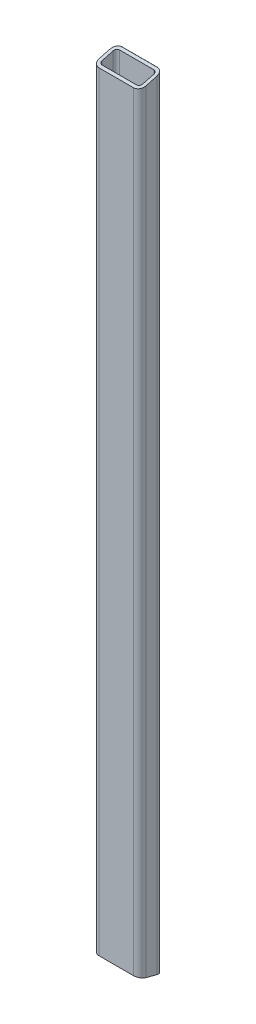
ISO-10303-21;
HEADER;
FILE_DESCRIPTION(('STEP AP214'),'2;1');
FILE_NAME('part.step','',(''),(''),'','','');
FILE_SCHEMA(('AUTOMOTIVE_DESIGN { 1 0 10303 214 1 1 1 1 }'));
ENDSEC;
DATA;
#1=APPLICATION_CONTEXT('core data for automotive mechanical design processes');
#2=APPLICATION_PROTOCOL_DEFINITION('international standard','automotive_design',2000,#1);
#3=PRODUCT_CONTEXT('',#1,'mechanical');
#4=PRODUCT('Part','Part','',(#3));
#5=PRODUCT_RELATED_PRODUCT_CATEGORY('part','',(#4));
#6=PRODUCT_DEFINITION_FORMATION('','',#4);
#7=PRODUCT_DEFINITION_CONTEXT('part definition',#1,'design');
#8=PRODUCT_DEFINITION('design','',#6,#7);
#9=PRODUCT_DEFINITION_SHAPE('','',#8);
#10=(LENGTH_UNIT() NAMED_UNIT(*) SI_UNIT(.MILLI.,.METRE.));
#11=(NAMED_UNIT(*) PLANE_ANGLE_UNIT() SI_UNIT($,.RADIAN.));
#12=(NAMED_UNIT(*) SI_UNIT($,.STERADIAN.) SOLID_ANGLE_UNIT());
#13=UNCERTAINTY_MEASURE_WITH_UNIT(LENGTH_MEASURE(1.E-05),#10,'distance_accuracy_value','');
#14=(GEOMETRIC_REPRESENTATION_CONTEXT(3) GLOBAL_UNCERTAINTY_ASSIGNED_CONTEXT((#13)) GLOBAL_UNIT_ASSIGNED_CONTEXT((#10,
#11,#12)) REPRESENTATION_CONTEXT('',''));
#15=CARTESIAN_POINT('',(0.,0.,0.));
#16=DIRECTION('',(0.,0.,1.));
#17=DIRECTION('',(1.,0.,0.));
#18=AXIS2_PLACEMENT_3D('',#15,#16,#17);
#19=CARTESIAN_POINT('',(-11.,-250.,3.5));
#20=DIRECTION('',(0.,1.,0.));
#21=DIRECTION('',(0.,0.,1.));
#22=AXIS2_PLACEMENT_3D('',#19,#20,#21);
#23=CYLINDRICAL_SURFACE('',#22,4.);
#24=DIRECTION('',(0.,1.,0.));
#25=VECTOR('',#24,1.);
#26=CARTESIAN_POINT('',(-15.,-250.,3.5));
#27=LINE('',#26,#25);
#28=CARTESIAN_POINT('',(-15.,-247.071796769725,3.5));
#29=VERTEX_POINT('',#28);
#30=CARTESIAN_POINT('',(-15.,247.071796769724,3.5));
#31=VERTEX_POINT('',#30);
#32=EDGE_CURVE('E388',#29,#31,#27,.T.);
#33=ORIENTED_EDGE('',*,*,#32,.F.);
#34=CARTESIAN_POINT('',(-11.,-247.071796769725,3.5));
#35=DIRECTION('',(0.,-0.965925826289068,0.258819045102522));
#36=DIRECTION('',(0.,0.258819045102522,0.965925826289068));
#37=AXIS2_PLACEMENT_3D('',#34,#35,#36);
#38=ELLIPSE('',#37,4.14110472164033,4.);
#39=CARTESIAN_POINT('',(-11.,-246.,7.5));
#40=VERTEX_POINT('',#39);
#41=EDGE_CURVE('E151',#29,#40,#38,.F.);
#42=ORIENTED_EDGE('',*,*,#41,.T.);
#43=DIRECTION('',(0.,1.,0.));
#44=VECTOR('',#43,1.);
#45=CARTESIAN_POINT('',(-11.,-250.,7.5));
#46=LINE('',#45,#44);
#47=CARTESIAN_POINT('',(-11.,246.,7.5));
#48=VERTEX_POINT('',#47);
#49=EDGE_CURVE('E387',#40,#48,#46,.T.);
#50=ORIENTED_EDGE('',*,*,#49,.T.);
#51=CARTESIAN_POINT('',(-11.,247.071796769724,3.5));
#52=DIRECTION('',(0.,-0.965925826289068,-0.258819045102522));
#53=DIRECTION('',(0.,0.258819045102522,-0.965925826289068));
#54=AXIS2_PLACEMENT_3D('',#51,#52,#53);
#55=ELLIPSE('',#54,4.14110472164033,4.);
#56=EDGE_CURVE('E160',#48,#31,#55,.T.);
#57=ORIENTED_EDGE('',*,*,#56,.T.);
#58=EDGE_LOOP('',(#33,#42,#50,#57));
#59=FACE_BOUND('',#58,.T.);
#60=ADVANCED_FACE('F140',(#59),#23,.T.);
#61=CARTESIAN_POINT('',(-15.,-250.,-3.5));
#62=DIRECTION('',(-1.,0.,0.));
#63=DIRECTION('',(0.,0.,1.));
#64=AXIS2_PLACEMENT_3D('',#61,#62,#63);
#65=PLANE('',#64);
#66=DIRECTION('',(0.,1.,0.));
#67=VECTOR('',#66,1.);
#68=CARTESIAN_POINT('',(-15.,-250.,-3.5));
#69=LINE('',#68,#67);
#70=CARTESIAN_POINT('',(-15.,-248.947441116742,-3.5));
#71=VERTEX_POINT('',#70);
#72=CARTESIAN_POINT('',(-15.,248.947441116742,-3.5));
#73=VERTEX_POINT('',#72);
#74=EDGE_CURVE('E282',#71,#73,#69,.T.);
#75=ORIENTED_EDGE('',*,*,#74,.F.);
#76=DIRECTION('',(0.,0.258819045102522,0.965925826289068));
#77=VECTOR('',#76,1.);
#78=CARTESIAN_POINT('',(-15.,-249.017949192431,-3.76313972081441));
#79=LINE('',#78,#77);
#80=EDGE_CURVE('E313',#71,#29,#79,.T.);
#81=ORIENTED_EDGE('',*,*,#80,.T.);
#82=ORIENTED_EDGE('',*,*,#32,.T.);
#83=DIRECTION('',(0.,-0.258819045102522,0.965925826289068));
#84=VECTOR('',#83,1.);
#85=CARTESIAN_POINT('',(-15.,215.52430013854,121.236860279186));
#86=LINE('',#85,#84);
#87=EDGE_CURVE('E311',#31,#73,#86,.F.);
#88=ORIENTED_EDGE('',*,*,#87,.T.);
#89=EDGE_LOOP('',(#75,#81,#82,#88));
#90=FACE_BOUND('',#89,.T.);
#91=ADVANCED_FACE('F440',(#90),#65,.T.);
#92=CARTESIAN_POINT('',(-11.,-250.,-3.5));
#93=DIRECTION('',(0.,1.,0.));
#94=DIRECTION('',(0.,0.,1.));
#95=AXIS2_PLACEMENT_3D('',#92,#93,#94);
#96=CYLINDRICAL_SURFACE('',#95,4.);
#97=CARTESIAN_POINT('',(-11.,-250.,-3.5));
#98=DIRECTION('',(0.,1.,0.));
#99=DIRECTION('',(0.,0.,1.));
#100=AXIS2_PLACEMENT_3D('',#97,#98,#99);
#101=CIRCLE('',#100,4.);
#102=CARTESIAN_POINT('',(-11.,-250.,-7.5));
#103=VERTEX_POINT('',#102);
#104=CARTESIAN_POINT('',(-11.7544662892758,-250.,-7.42820323027544));
#105=VERTEX_POINT('',#104);
#106=EDGE_CURVE('E385',#103,#105,#101,.T.);
#107=ORIENTED_EDGE('',*,*,#106,.T.);
#108=CARTESIAN_POINT('',(-11.,-248.947441116742,-3.5));
#109=DIRECTION('',(0.,-0.965925826289068,0.258819045102522));
#110=DIRECTION('',(0.,0.258819045102522,0.965925826289068));
#111=AXIS2_PLACEMENT_3D('',#108,#109,#110);
#112=ELLIPSE('',#111,4.14110472164033,4.);
#113=EDGE_CURVE('E286',#105,#71,#112,.F.);
#114=ORIENTED_EDGE('',*,*,#113,.T.);
#115=ORIENTED_EDGE('',*,*,#74,.T.);
#116=CARTESIAN_POINT('',(-11.,248.947441116742,-3.5));
#117=DIRECTION('',(0.,-0.965925826289068,-0.258819045102522));
#118=DIRECTION('',(0.,0.258819045102522,-0.965925826289068));
#119=AXIS2_PLACEMENT_3D('',#116,#117,#118);
#120=ELLIPSE('',#119,4.14110472164033,4.);
#121=CARTESIAN_POINT('',(-11.7544662892758,250.,-7.42820323027544));
#122=VERTEX_POINT('',#121);
#123=EDGE_CURVE('E276',#73,#122,#120,.T.);
#124=ORIENTED_EDGE('',*,*,#123,.T.);
#125=CARTESIAN_POINT('',(-11.,250.,-3.5));
#126=DIRECTION('',(0.,1.,0.));
#127=DIRECTION('',(0.,0.,1.));
#128=AXIS2_PLACEMENT_3D('',#125,#126,#127);
#129=CIRCLE('',#128,4.);
#130=CARTESIAN_POINT('',(-11.,250.,-7.5));
#131=VERTEX_POINT('',#130);
#132=EDGE_CURVE('E280',#131,#122,#129,.T.);
#133=ORIENTED_EDGE('',*,*,#132,.F.);
#134=DIRECTION('',(0.,1.,0.));
#135=VECTOR('',#134,1.);
#136=CARTESIAN_POINT('',(-11.,-250.,-7.5));
#137=LINE('',#136,#135);
#138=EDGE_CURVE('E392',#103,#131,#137,.T.);
#139=ORIENTED_EDGE('',*,*,#138,.F.);
#140=EDGE_LOOP('',(#107,#114,#115,#124,#133,#139));
#141=FACE_BOUND('',#140,.T.);
#142=ADVANCED_FACE('F279',(#141),#96,.T.);
#143=CARTESIAN_POINT('',(-11.,-250.,-7.5));
#144=DIRECTION('',(0.,0.,-1.));
#145=DIRECTION('',(-1.,0.,0.));
#146=AXIS2_PLACEMENT_3D('',#143,#144,#145);
#147=PLANE('',#146);
#148=ORIENTED_EDGE('',*,*,#138,.T.);
#149=DIRECTION('',(-1.,0.,0.));
#150=VECTOR('',#149,1.);
#151=CARTESIAN_POINT('',(-11.,250.,-7.5));
#152=LINE('',#151,#150);
#153=CARTESIAN_POINT('',(11.,250.,-7.5));
#154=VERTEX_POINT('',#153);
#155=EDGE_CURVE('E291',#154,#131,#152,.T.);
#156=ORIENTED_EDGE('',*,*,#155,.F.);
#157=DIRECTION('',(0.,1.,0.));
#158=VECTOR('',#157,1.);
#159=CARTESIAN_POINT('',(11.,-250.,-7.5));
#160=LINE('',#159,#158);
#161=CARTESIAN_POINT('',(11.,-250.,-7.5));
#162=VERTEX_POINT('',#161);
#163=EDGE_CURVE('E394',#162,#154,#160,.T.);
#164=ORIENTED_EDGE('',*,*,#163,.F.);
#165=DIRECTION('',(-1.,0.,0.));
#166=VECTOR('',#165,1.);
#167=CARTESIAN_POINT('',(-11.,-250.,-7.5));
#168=LINE('',#167,#166);
#169=EDGE_CURVE('E382',#162,#103,#168,.T.);
#170=ORIENTED_EDGE('',*,*,#169,.T.);
#171=EDGE_LOOP('',(#148,#156,#164,#170));
#172=FACE_BOUND('',#171,.T.);
#173=ADVANCED_FACE('F447',(#172),#147,.T.);
#174=CARTESIAN_POINT('',(11.,-250.,-3.5));
#175=DIRECTION('',(0.,1.,0.));
#176=DIRECTION('',(0.,0.,1.));
#177=AXIS2_PLACEMENT_3D('',#174,#175,#176);
#178=CYLINDRICAL_SURFACE('',#177,4.);
#179=DIRECTION('',(0.,1.,0.));
#180=VECTOR('',#179,1.);
#181=CARTESIAN_POINT('',(15.,-250.,-3.5));
#182=LINE('',#181,#180);
#183=CARTESIAN_POINT('',(15.,-248.947441116742,-3.5));
#184=VERTEX_POINT('',#183);
#185=CARTESIAN_POINT('',(15.,248.947441116742,-3.5));
#186=VERTEX_POINT('',#185);
#187=EDGE_CURVE('E396',#184,#186,#182,.T.);
#188=ORIENTED_EDGE('',*,*,#187,.F.);
#189=CARTESIAN_POINT('',(11.,-248.947441116742,-3.5));
#190=DIRECTION('',(0.,-0.965925826289068,0.258819045102522));
#191=DIRECTION('',(0.,0.258819045102522,0.965925826289068));
#192=AXIS2_PLACEMENT_3D('',#189,#190,#191);
#193=ELLIPSE('',#192,4.14110472164033,4.);
#194=CARTESIAN_POINT('',(11.7544662892758,-250.,-7.42820323027544));
#195=VERTEX_POINT('',#194);
#196=EDGE_CURVE('E302',#184,#195,#193,.F.);
#197=ORIENTED_EDGE('',*,*,#196,.T.);
#198=CARTESIAN_POINT('',(11.,-250.,-3.5));
#199=DIRECTION('',(0.,1.,0.));
#200=DIRECTION('',(0.,0.,-1.));
#201=AXIS2_PLACEMENT_3D('',#198,#199,#200);
#202=CIRCLE('',#201,4.);
#203=EDGE_CURVE('E366',#195,#162,#202,.T.);
#204=ORIENTED_EDGE('',*,*,#203,.T.);
#205=ORIENTED_EDGE('',*,*,#163,.T.);
#206=CARTESIAN_POINT('',(11.,250.,-3.5));
#207=DIRECTION('',(0.,1.,0.));
#208=DIRECTION('',(0.,0.,-1.));
#209=AXIS2_PLACEMENT_3D('',#206,#207,#208);
#210=CIRCLE('',#209,4.);
#211=CARTESIAN_POINT('',(11.7544662892758,250.,-7.42820323027544));
#212=VERTEX_POINT('',#211);
#213=EDGE_CURVE('E225',#212,#154,#210,.T.);
#214=ORIENTED_EDGE('',*,*,#213,.F.);
#215=CARTESIAN_POINT('',(11.,248.947441116742,-3.5));
#216=DIRECTION('',(0.,-0.965925826289068,-0.258819045102522));
#217=DIRECTION('',(0.,0.258819045102522,-0.965925826289068));
#218=AXIS2_PLACEMENT_3D('',#215,#216,#217);
#219=ELLIPSE('',#218,4.14110472164033,4.);
#220=EDGE_CURVE('E296',#212,#186,#219,.T.);
#221=ORIENTED_EDGE('',*,*,#220,.T.);
#222=EDGE_LOOP('',(#188,#197,#204,#205,#214,#221));
#223=FACE_BOUND('',#222,.T.);
#224=ADVANCED_FACE('F432',(#223),#178,.T.);
#225=CARTESIAN_POINT('',(15.,-250.,-3.5));
#226=DIRECTION('',(1.,0.,0.));
#227=DIRECTION('',(0.,0.,-1.));
#228=AXIS2_PLACEMENT_3D('',#225,#226,#227);
#229=PLANE('',#228);
#230=DIRECTION('',(0.,1.,0.));
#231=VECTOR('',#230,1.);
#232=CARTESIAN_POINT('',(15.,-250.,3.5));
#233=LINE('',#232,#231);
#234=CARTESIAN_POINT('',(15.,-247.071796769725,3.5));
#235=VERTEX_POINT('',#234);
#236=CARTESIAN_POINT('',(15.,247.071796769724,3.5));
#237=VERTEX_POINT('',#236);
#238=EDGE_CURVE('E398',#235,#237,#233,.T.);
#239=ORIENTED_EDGE('',*,*,#238,.F.);
#240=DIRECTION('',(0.,-0.258819045102522,-0.965925826289068));
#241=VECTOR('',#240,1.);
#242=CARTESIAN_POINT('',(15.,-249.017949192431,-3.76313972081441));
#243=LINE('',#242,#241);
#244=EDGE_CURVE('E303',#235,#184,#243,.T.);
#245=ORIENTED_EDGE('',*,*,#244,.T.);
#246=ORIENTED_EDGE('',*,*,#187,.T.);
#247=DIRECTION('',(0.,0.258819045102522,-0.965925826289068));
#248=VECTOR('',#247,1.);
#249=CARTESIAN_POINT('',(15.,215.52430013854,121.236860279186));
#250=LINE('',#249,#248);
#251=EDGE_CURVE('E298',#186,#237,#250,.F.);
#252=ORIENTED_EDGE('',*,*,#251,.T.);
#253=EDGE_LOOP('',(#239,#245,#246,#252));
#254=FACE_BOUND('',#253,.T.);
#255=ADVANCED_FACE('F414',(#254),#229,.T.);
#256=CARTESIAN_POINT('',(11.,-250.,3.5));
#257=DIRECTION('',(0.,1.,0.));
#258=DIRECTION('',(0.,0.,1.));
#259=AXIS2_PLACEMENT_3D('',#256,#257,#258);
#260=CYLINDRICAL_SURFACE('',#259,4.);
#261=DIRECTION('',(0.,1.,0.));
#262=VECTOR('',#261,1.);
#263=CARTESIAN_POINT('',(11.,-250.,7.5));
#264=LINE('',#263,#262);
#265=CARTESIAN_POINT('',(11.,-246.,7.5));
#266=VERTEX_POINT('',#265);
#267=CARTESIAN_POINT('',(11.,246.,7.5));
#268=VERTEX_POINT('',#267);
#269=EDGE_CURVE('E401',#266,#268,#264,.T.);
#270=ORIENTED_EDGE('',*,*,#269,.F.);
#271=CARTESIAN_POINT('',(11.,-247.071796769725,3.5));
#272=DIRECTION('',(0.,-0.965925826289068,0.258819045102522));
#273=DIRECTION('',(0.,0.258819045102522,0.965925826289068));
#274=AXIS2_PLACEMENT_3D('',#271,#272,#273);
#275=ELLIPSE('',#274,4.14110472164033,4.);
#276=EDGE_CURVE('E411',#266,#235,#275,.F.);
#277=ORIENTED_EDGE('',*,*,#276,.T.);
#278=ORIENTED_EDGE('',*,*,#238,.T.);
#279=CARTESIAN_POINT('',(11.,247.071796769724,3.5));
#280=DIRECTION('',(0.,-0.965925826289068,-0.258819045102522));
#281=DIRECTION('',(0.,0.258819045102522,-0.965925826289068));
#282=AXIS2_PLACEMENT_3D('',#279,#280,#281);
#283=ELLIPSE('',#282,4.14110472164033,4.);
#284=EDGE_CURVE('E409',#237,#268,#283,.T.);
#285=ORIENTED_EDGE('',*,*,#284,.T.);
#286=EDGE_LOOP('',(#270,#277,#278,#285));
#287=FACE_BOUND('',#286,.T.);
#288=ADVANCED_FACE('F418',(#287),#260,.T.);
#289=CARTESIAN_POINT('',(-11.,-250.,7.5));
#290=DIRECTION('',(0.,0.,1.));
#291=DIRECTION('',(1.,0.,0.));
#292=AXIS2_PLACEMENT_3D('',#289,#290,#291);
#293=PLANE('',#292);
#294=ORIENTED_EDGE('',*,*,#49,.F.);
#295=DIRECTION('',(1.,0.,0.));
#296=VECTOR('',#295,1.);
#297=CARTESIAN_POINT('',(11.,-246.,7.5));
#298=LINE('',#297,#296);
#299=EDGE_CURVE('E406',#40,#266,#298,.T.);
#300=ORIENTED_EDGE('',*,*,#299,.T.);
#301=ORIENTED_EDGE('',*,*,#269,.T.);
#302=DIRECTION('',(-1.,0.,0.));
#303=VECTOR('',#302,1.);
#304=CARTESIAN_POINT('',(-11.,246.,7.5));
#305=LINE('',#304,#303);
#306=EDGE_CURVE('E390',#268,#48,#305,.T.);
#307=ORIENTED_EDGE('',*,*,#306,.T.);
#308=EDGE_LOOP('',(#294,#300,#301,#307));
#309=FACE_BOUND('',#308,.T.);
#310=ADVANCED_FACE('F422',(#309),#293,.T.);
#311=CARTESIAN_POINT('',(-11.,-250.,3.5));
#312=DIRECTION('',(0.,1.,0.));
#313=DIRECTION('',(0.,0.,1.));
#314=AXIS2_PLACEMENT_3D('',#311,#312,#313);
#315=PLANE('',#314);
#316=ORIENTED_EDGE('',*,*,#203,.F.);
#317=DIRECTION('',(-1.,0.,0.));
#318=VECTOR('',#317,1.);
#319=CARTESIAN_POINT('',(-11.,-250.,-7.42820323027544));
#320=LINE('',#319,#318);
#321=EDGE_CURVE('E287',#195,#105,#320,.T.);
#322=ORIENTED_EDGE('',*,*,#321,.T.);
#323=ORIENTED_EDGE('',*,*,#106,.F.);
#324=ORIENTED_EDGE('',*,*,#169,.F.);
#325=EDGE_LOOP('',(#316,#322,#323,#324));
#326=FACE_BOUND('',#325,.T.);
#327=ADVANCED_FACE('F437',(#326),#315,.F.);
#328=CARTESIAN_POINT('',(-11.,-250.,3.5));
#329=DIRECTION('',(0.,1.,0.));
#330=DIRECTION('',(0.,0.,1.));
#331=AXIS2_PLACEMENT_3D('',#328,#329,#330);
#332=CYLINDRICAL_SURFACE('',#331,2.);
#333=DIRECTION('',(0.,1.,0.));
#334=VECTOR('',#333,1.);
#335=CARTESIAN_POINT('',(-13.,-250.,3.5));
#336=LINE('',#335,#334);
#337=CARTESIAN_POINT('',(-13.,-247.071796769725,3.5));
#338=VERTEX_POINT('',#337);
#339=CARTESIAN_POINT('',(-13.,247.071796769724,3.5));
#340=VERTEX_POINT('',#339);
#341=EDGE_CURVE('E218',#338,#340,#336,.T.);
#342=ORIENTED_EDGE('',*,*,#341,.T.);
#343=CARTESIAN_POINT('',(-11.,247.071796769724,3.5));
#344=DIRECTION('',(0.,-0.965925826289068,-0.258819045102522));
#345=DIRECTION('',(0.,0.258819045102522,-0.965925826289068));
#346=AXIS2_PLACEMENT_3D('',#343,#344,#345);
#347=ELLIPSE('',#346,2.07055236082017,2.);
#348=CARTESIAN_POINT('',(-11.,246.535898384862,5.5));
#349=VERTEX_POINT('',#348);
#350=EDGE_CURVE('E145',#340,#349,#347,.F.);
#351=ORIENTED_EDGE('',*,*,#350,.T.);
#352=DIRECTION('',(0.,1.,0.));
#353=VECTOR('',#352,1.);
#354=CARTESIAN_POINT('',(-11.,-250.,5.5));
#355=LINE('',#354,#353);
#356=CARTESIAN_POINT('',(-11.,-246.535898384862,5.5));
#357=VERTEX_POINT('',#356);
#358=EDGE_CURVE('E320',#357,#349,#355,.T.);
#359=ORIENTED_EDGE('',*,*,#358,.F.);
#360=CARTESIAN_POINT('',(-11.,-247.071796769725,3.5));
#361=DIRECTION('',(0.,-0.965925826289068,0.258819045102522));
#362=DIRECTION('',(0.,0.258819045102522,0.965925826289068));
#363=AXIS2_PLACEMENT_3D('',#360,#361,#362);
#364=ELLIPSE('',#363,2.07055236082017,2.);
#365=EDGE_CURVE('E292',#338,#357,#364,.F.);
#366=ORIENTED_EDGE('',*,*,#365,.F.);
#367=EDGE_LOOP('',(#342,#351,#359,#366));
#368=FACE_BOUND('',#367,.T.);
#369=ADVANCED_FACE('F484',(#368),#332,.F.);
#370=CARTESIAN_POINT('',(-13.,-250.,-3.5));
#371=DIRECTION('',(-1.,0.,0.));
#372=DIRECTION('',(0.,0.,1.));
#373=AXIS2_PLACEMENT_3D('',#370,#371,#372);
#374=PLANE('',#373);
#375=DIRECTION('',(0.,1.,0.));
#376=VECTOR('',#375,1.);
#377=CARTESIAN_POINT('',(-13.,-250.,-3.5));
#378=LINE('',#377,#376);
#379=CARTESIAN_POINT('',(-13.,-248.947441116742,-3.5));
#380=VERTEX_POINT('',#379);
#381=CARTESIAN_POINT('',(-13.,248.947441116742,-3.5));
#382=VERTEX_POINT('',#381);
#383=EDGE_CURVE('E367',#380,#382,#378,.T.);
#384=ORIENTED_EDGE('',*,*,#383,.T.);
#385=DIRECTION('',(0.,0.258819045102522,-0.965925826289068));
#386=VECTOR('',#385,1.);
#387=CARTESIAN_POINT('',(-13.,250.,-7.42820323027544));
#388=LINE('',#387,#386);
#389=EDGE_CURVE('E358',#382,#340,#388,.F.);
#390=ORIENTED_EDGE('',*,*,#389,.T.);
#391=ORIENTED_EDGE('',*,*,#341,.F.);
#392=DIRECTION('',(0.,0.258819045102522,0.965925826289068));
#393=VECTOR('',#392,1.);
#394=CARTESIAN_POINT('',(-13.,-249.017949192431,-3.76313972081441));
#395=LINE('',#394,#393);
#396=EDGE_CURVE('E317',#380,#338,#395,.T.);
#397=ORIENTED_EDGE('',*,*,#396,.F.);
#398=EDGE_LOOP('',(#384,#390,#391,#397));
#399=FACE_BOUND('',#398,.T.);
#400=ADVANCED_FACE('F480',(#399),#374,.F.);
#401=CARTESIAN_POINT('',(-11.,-250.,-3.5));
#402=DIRECTION('',(0.,1.,0.));
#403=DIRECTION('',(0.,0.,1.));
#404=AXIS2_PLACEMENT_3D('',#401,#402,#403);
#405=CYLINDRICAL_SURFACE('',#404,2.);
#406=DIRECTION('',(0.,1.,0.));
#407=VECTOR('',#406,1.);
#408=CARTESIAN_POINT('',(-11.,-250.,-5.5));
#409=LINE('',#408,#407);
#410=CARTESIAN_POINT('',(-11.,-249.483339501605,-5.5));
#411=VERTEX_POINT('',#410);
#412=CARTESIAN_POINT('',(-11.,249.483339501604,-5.5));
#413=VERTEX_POINT('',#412);
#414=EDGE_CURVE('E369',#411,#413,#409,.T.);
#415=ORIENTED_EDGE('',*,*,#414,.T.);
#416=CARTESIAN_POINT('',(-11.,248.947441116742,-3.5));
#417=DIRECTION('',(0.,-0.965925826289068,-0.258819045102522));
#418=DIRECTION('',(0.,0.258819045102522,-0.965925826289068));
#419=AXIS2_PLACEMENT_3D('',#416,#417,#418);
#420=ELLIPSE('',#419,2.07055236082017,2.);
#421=EDGE_CURVE('E356',#413,#382,#420,.F.);
#422=ORIENTED_EDGE('',*,*,#421,.T.);
#423=ORIENTED_EDGE('',*,*,#383,.F.);
#424=CARTESIAN_POINT('',(-11.,-248.947441116742,-3.5));
#425=DIRECTION('',(0.,-0.965925826289068,0.258819045102522));
#426=DIRECTION('',(0.,0.258819045102522,0.965925826289068));
#427=AXIS2_PLACEMENT_3D('',#424,#425,#426);
#428=ELLIPSE('',#427,2.07055236082017,2.);
#429=EDGE_CURVE('E321',#411,#380,#428,.F.);
#430=ORIENTED_EDGE('',*,*,#429,.F.);
#431=EDGE_LOOP('',(#415,#422,#423,#430));
#432=FACE_BOUND('',#431,.T.);
#433=ADVANCED_FACE('F483',(#432),#405,.F.);
#434=CARTESIAN_POINT('',(-11.,-250.,-5.5));
#435=DIRECTION('',(0.,0.,-1.));
#436=DIRECTION('',(-1.,0.,0.));
#437=AXIS2_PLACEMENT_3D('',#434,#435,#436);
#438=PLANE('',#437);
#439=DIRECTION('',(0.,1.,0.));
#440=VECTOR('',#439,1.);
#441=CARTESIAN_POINT('',(11.,-250.,-5.5));
#442=LINE('',#441,#440);
#443=CARTESIAN_POINT('',(11.,-249.483339501605,-5.5));
#444=VERTEX_POINT('',#443);
#445=CARTESIAN_POINT('',(11.,249.483339501604,-5.5));
#446=VERTEX_POINT('',#445);
#447=EDGE_CURVE('E371',#444,#446,#442,.T.);
#448=ORIENTED_EDGE('',*,*,#447,.T.);
#449=DIRECTION('',(1.,0.,0.));
#450=VECTOR('',#449,1.);
#451=CARTESIAN_POINT('',(-11.,249.483339501604,-5.5));
#452=LINE('',#451,#450);
#453=EDGE_CURVE('E353',#446,#413,#452,.F.);
#454=ORIENTED_EDGE('',*,*,#453,.T.);
#455=ORIENTED_EDGE('',*,*,#414,.F.);
#456=DIRECTION('',(-1.,0.,0.));
#457=VECTOR('',#456,1.);
#458=CARTESIAN_POINT('',(-11.,-249.483339501605,-5.5));
#459=LINE('',#458,#457);
#460=EDGE_CURVE('E324',#444,#411,#459,.T.);
#461=ORIENTED_EDGE('',*,*,#460,.F.);
#462=EDGE_LOOP('',(#448,#454,#455,#461));
#463=FACE_BOUND('',#462,.T.);
#464=ADVANCED_FACE('F487',(#463),#438,.F.);
#465=CARTESIAN_POINT('',(11.,-250.,-3.5));
#466=DIRECTION('',(0.,1.,0.));
#467=DIRECTION('',(0.,0.,1.));
#468=AXIS2_PLACEMENT_3D('',#465,#466,#467);
#469=CYLINDRICAL_SURFACE('',#468,2.);
#470=DIRECTION('',(0.,1.,0.));
#471=VECTOR('',#470,1.);
#472=CARTESIAN_POINT('',(13.,-250.,-3.5));
#473=LINE('',#472,#471);
#474=CARTESIAN_POINT('',(13.,-248.947441116742,-3.5));
#475=VERTEX_POINT('',#474);
#476=CARTESIAN_POINT('',(13.,248.947441116742,-3.5));
#477=VERTEX_POINT('',#476);
#478=EDGE_CURVE('E373',#475,#477,#473,.T.);
#479=ORIENTED_EDGE('',*,*,#478,.T.);
#480=CARTESIAN_POINT('',(11.,248.947441116742,-3.5));
#481=DIRECTION('',(0.,-0.965925826289068,-0.258819045102522));
#482=DIRECTION('',(0.,0.258819045102522,-0.965925826289068));
#483=AXIS2_PLACEMENT_3D('',#480,#481,#482);
#484=ELLIPSE('',#483,2.07055236082017,2.);
#485=EDGE_CURVE('E350',#477,#446,#484,.F.);
#486=ORIENTED_EDGE('',*,*,#485,.T.);
#487=ORIENTED_EDGE('',*,*,#447,.F.);
#488=CARTESIAN_POINT('',(11.,-248.947441116742,-3.5));
#489=DIRECTION('',(0.,-0.965925826289068,0.258819045102522));
#490=DIRECTION('',(0.,0.258819045102522,0.965925826289068));
#491=AXIS2_PLACEMENT_3D('',#488,#489,#490);
#492=ELLIPSE('',#491,2.07055236082017,2.);
#493=EDGE_CURVE('E327',#475,#444,#492,.F.);
#494=ORIENTED_EDGE('',*,*,#493,.F.);
#495=EDGE_LOOP('',(#479,#486,#487,#494));
#496=FACE_BOUND('',#495,.T.);
#497=ADVANCED_FACE('F491',(#496),#469,.F.);
#498=CARTESIAN_POINT('',(13.,-250.,-3.5));
#499=DIRECTION('',(1.,0.,0.));
#500=DIRECTION('',(0.,0.,-1.));
#501=AXIS2_PLACEMENT_3D('',#498,#499,#500);
#502=PLANE('',#501);
#503=DIRECTION('',(0.,1.,0.));
#504=VECTOR('',#503,1.);
#505=CARTESIAN_POINT('',(13.,-250.,3.5));
#506=LINE('',#505,#504);
#507=CARTESIAN_POINT('',(13.,-247.071796769725,3.5));
#508=VERTEX_POINT('',#507);
#509=CARTESIAN_POINT('',(13.,247.071796769724,3.5));
#510=VERTEX_POINT('',#509);
#511=EDGE_CURVE('E375',#508,#510,#506,.T.);
#512=ORIENTED_EDGE('',*,*,#511,.T.);
#513=DIRECTION('',(0.,-0.258819045102522,0.965925826289068));
#514=VECTOR('',#513,1.);
#515=CARTESIAN_POINT('',(13.,250.,-7.42820323027544));
#516=LINE('',#515,#514);
#517=EDGE_CURVE('E347',#510,#477,#516,.F.);
#518=ORIENTED_EDGE('',*,*,#517,.T.);
#519=ORIENTED_EDGE('',*,*,#478,.F.);
#520=DIRECTION('',(0.,-0.258819045102522,-0.965925826289068));
#521=VECTOR('',#520,1.);
#522=CARTESIAN_POINT('',(13.,-249.017949192431,-3.76313972081441));
#523=LINE('',#522,#521);
#524=EDGE_CURVE('E330',#508,#475,#523,.T.);
#525=ORIENTED_EDGE('',*,*,#524,.F.);
#526=EDGE_LOOP('',(#512,#518,#519,#525));
#527=FACE_BOUND('',#526,.T.);
#528=ADVANCED_FACE('F495',(#527),#502,.F.);
#529=CARTESIAN_POINT('',(11.,-250.,3.5));
#530=DIRECTION('',(0.,1.,0.));
#531=DIRECTION('',(0.,0.,1.));
#532=AXIS2_PLACEMENT_3D('',#529,#530,#531);
#533=CYLINDRICAL_SURFACE('',#532,2.);
#534=DIRECTION('',(0.,1.,0.));
#535=VECTOR('',#534,1.);
#536=CARTESIAN_POINT('',(11.,-250.,5.5));
#537=LINE('',#536,#535);
#538=CARTESIAN_POINT('',(11.,-246.535898384862,5.5));
#539=VERTEX_POINT('',#538);
#540=CARTESIAN_POINT('',(11.,246.535898384862,5.5));
#541=VERTEX_POINT('',#540);
#542=EDGE_CURVE('E377',#539,#541,#537,.T.);
#543=ORIENTED_EDGE('',*,*,#542,.T.);
#544=CARTESIAN_POINT('',(11.,247.071796769724,3.5));
#545=DIRECTION('',(0.,-0.965925826289068,-0.258819045102522));
#546=DIRECTION('',(0.,0.258819045102522,-0.965925826289068));
#547=AXIS2_PLACEMENT_3D('',#544,#545,#546);
#548=ELLIPSE('',#547,2.07055236082017,2.);
#549=EDGE_CURVE('E344',#541,#510,#548,.F.);
#550=ORIENTED_EDGE('',*,*,#549,.T.);
#551=ORIENTED_EDGE('',*,*,#511,.F.);
#552=CARTESIAN_POINT('',(11.,-247.071796769725,3.5));
#553=DIRECTION('',(0.,-0.965925826289068,0.258819045102522));
#554=DIRECTION('',(0.,0.258819045102522,0.965925826289068));
#555=AXIS2_PLACEMENT_3D('',#552,#553,#554);
#556=ELLIPSE('',#555,2.07055236082017,2.);
#557=EDGE_CURVE('E333',#539,#508,#556,.F.);
#558=ORIENTED_EDGE('',*,*,#557,.F.);
#559=EDGE_LOOP('',(#543,#550,#551,#558));
#560=FACE_BOUND('',#559,.T.);
#561=ADVANCED_FACE('F476',(#560),#533,.F.);
#562=CARTESIAN_POINT('',(-11.,-250.,5.5));
#563=DIRECTION('',(0.,0.,1.));
#564=DIRECTION('',(1.,0.,0.));
#565=AXIS2_PLACEMENT_3D('',#562,#563,#564);
#566=PLANE('',#565);
#567=ORIENTED_EDGE('',*,*,#358,.T.);
#568=DIRECTION('',(-1.,0.,0.));
#569=VECTOR('',#568,1.);
#570=CARTESIAN_POINT('',(-11.,246.535898384862,5.5));
#571=LINE('',#570,#569);
#572=EDGE_CURVE('E341',#349,#541,#571,.F.);
#573=ORIENTED_EDGE('',*,*,#572,.T.);
#574=ORIENTED_EDGE('',*,*,#542,.F.);
#575=DIRECTION('',(1.,0.,0.));
#576=VECTOR('',#575,1.);
#577=CARTESIAN_POINT('',(-11.,-246.535898384862,5.5));
#578=LINE('',#577,#576);
#579=EDGE_CURVE('E336',#357,#539,#578,.T.);
#580=ORIENTED_EDGE('',*,*,#579,.F.);
#581=EDGE_LOOP('',(#567,#573,#574,#580));
#582=FACE_BOUND('',#581,.T.);
#583=ADVANCED_FACE('F471',(#582),#566,.F.);
#584=CARTESIAN_POINT('',(-11.,250.,3.5));
#585=DIRECTION('',(0.,1.,0.));
#586=DIRECTION('',(0.,0.,1.));
#587=AXIS2_PLACEMENT_3D('',#584,#585,#586);
#588=PLANE('',#587);
#589=ORIENTED_EDGE('',*,*,#132,.T.);
#590=DIRECTION('',(1.,0.,0.));
#591=VECTOR('',#590,1.);
#592=CARTESIAN_POINT('',(-11.,250.,-7.42820323027544));
#593=LINE('',#592,#591);
#594=EDGE_CURVE('E12',#122,#212,#593,.T.);
#595=ORIENTED_EDGE('',*,*,#594,.T.);
#596=ORIENTED_EDGE('',*,*,#213,.T.);
#597=ORIENTED_EDGE('',*,*,#155,.T.);
#598=EDGE_LOOP('',(#589,#595,#596,#597));
#599=FACE_BOUND('',#598,.T.);
#600=ADVANCED_FACE('F289',(#599),#588,.T.);
#601=CARTESIAN_POINT('',(-11.,-246.,7.5));
#602=DIRECTION('',(0.,-0.965925826289068,0.258819045102522));
#603=DIRECTION('',(-1.,0.,0.));
#604=AXIS2_PLACEMENT_3D('',#601,#602,#603);
#605=PLANE('',#604);
#606=ORIENTED_EDGE('',*,*,#113,.F.);
#607=ORIENTED_EDGE('',*,*,#321,.F.);
#608=ORIENTED_EDGE('',*,*,#196,.F.);
#609=ORIENTED_EDGE('',*,*,#244,.F.);
#610=ORIENTED_EDGE('',*,*,#276,.F.);
#611=ORIENTED_EDGE('',*,*,#299,.F.);
#612=ORIENTED_EDGE('',*,*,#41,.F.);
#613=ORIENTED_EDGE('',*,*,#80,.F.);
#614=EDGE_LOOP('',(#606,#607,#608,#609,#610,#611,#612,#613));
#615=FACE_BOUND('',#614,.T.);
#616=ORIENTED_EDGE('',*,*,#396,.T.);
#617=ORIENTED_EDGE('',*,*,#365,.T.);
#618=ORIENTED_EDGE('',*,*,#579,.T.);
#619=ORIENTED_EDGE('',*,*,#557,.T.);
#620=ORIENTED_EDGE('',*,*,#524,.T.);
#621=ORIENTED_EDGE('',*,*,#493,.T.);
#622=ORIENTED_EDGE('',*,*,#460,.T.);
#623=ORIENTED_EDGE('',*,*,#429,.T.);
#624=EDGE_LOOP('',(#616,#617,#618,#619,#620,#621,#622,#623));
#625=FACE_BOUND('',#624,.T.);
#626=ADVANCED_FACE('F428',(#615,#625),#605,.T.);
#627=CARTESIAN_POINT('',(-11.,250.,-7.42820323027544));
#628=DIRECTION('',(0.,-0.965925826289068,-0.258819045102522));
#629=DIRECTION('',(1.,0.,0.));
#630=AXIS2_PLACEMENT_3D('',#627,#628,#629);
#631=PLANE('',#630);
#632=ORIENTED_EDGE('',*,*,#56,.F.);
#633=ORIENTED_EDGE('',*,*,#306,.F.);
#634=ORIENTED_EDGE('',*,*,#284,.F.);
#635=ORIENTED_EDGE('',*,*,#251,.F.);
#636=ORIENTED_EDGE('',*,*,#220,.F.);
#637=ORIENTED_EDGE('',*,*,#594,.F.);
#638=ORIENTED_EDGE('',*,*,#123,.F.);
#639=ORIENTED_EDGE('',*,*,#87,.F.);
#640=EDGE_LOOP('',(#632,#633,#634,#635,#636,#637,#638,#639));
#641=FACE_BOUND('',#640,.T.);
#642=ORIENTED_EDGE('',*,*,#572,.F.);
#643=ORIENTED_EDGE('',*,*,#350,.F.);
#644=ORIENTED_EDGE('',*,*,#389,.F.);
#645=ORIENTED_EDGE('',*,*,#421,.F.);
#646=ORIENTED_EDGE('',*,*,#453,.F.);
#647=ORIENTED_EDGE('',*,*,#485,.F.);
#648=ORIENTED_EDGE('',*,*,#517,.F.);
#649=ORIENTED_EDGE('',*,*,#549,.F.);
#650=EDGE_LOOP('',(#642,#643,#644,#645,#646,#647,#648,#649));
#651=FACE_BOUND('',#650,.T.);
#652=ADVANCED_FACE('F143',(#641,#651),#631,.F.);
#653=CLOSED_SHELL('',(#60,#91,#142,#173,#224,#255,#288,#310,#327,#369,#400,#433,#464,#497,#528,
#561,#583,#600,#626,#652));
#654=MANIFOLD_SOLID_BREP('B2',#653);
#655=ADVANCED_BREP_SHAPE_REPRESENTATION('',(#18,#654),#14);
#656=SHAPE_DEFINITION_REPRESENTATION(#9,#655);
ENDSEC;
END-ISO-10303-21;
